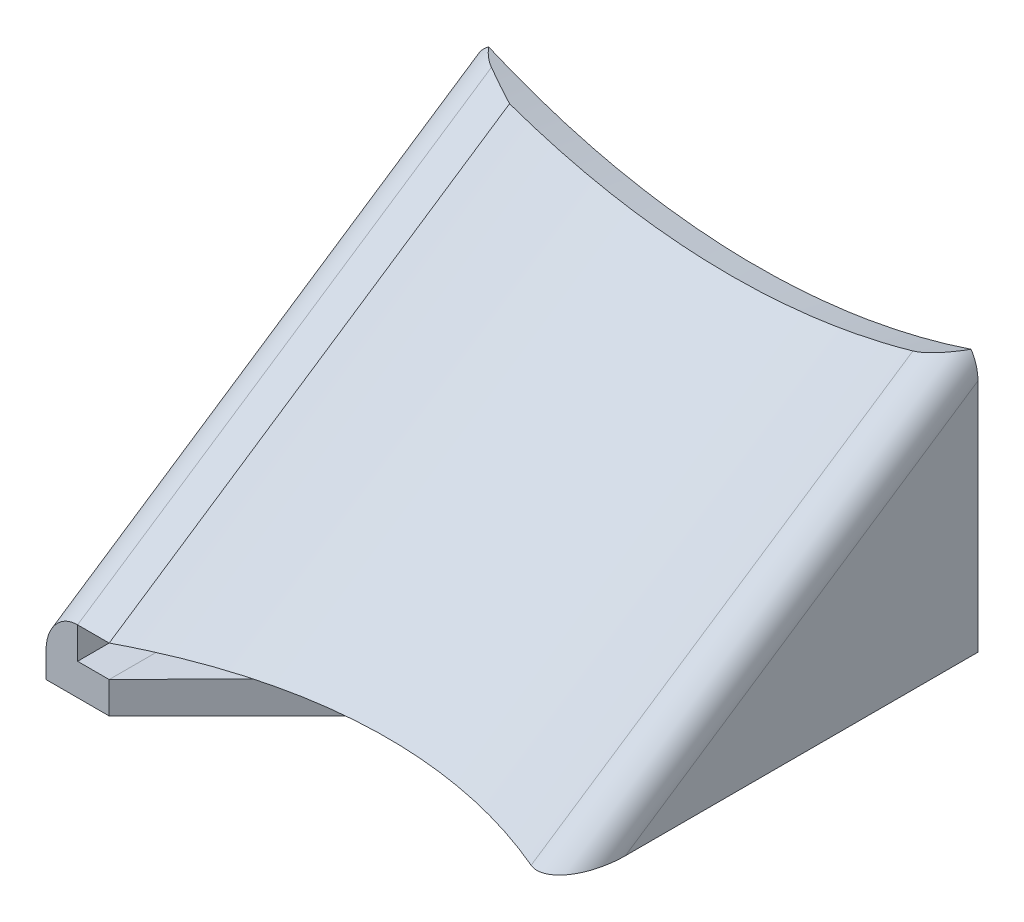
ISO-10303-21;
HEADER;
FILE_DESCRIPTION(('STEP AP214'),'2;1');
FILE_NAME('part.step','',(''),(''),'','','');
FILE_SCHEMA(('AUTOMOTIVE_DESIGN { 1 0 10303 214 1 1 1 1 }'));
ENDSEC;
DATA;
#1=APPLICATION_CONTEXT('core data for automotive mechanical design processes');
#2=APPLICATION_PROTOCOL_DEFINITION('international standard','automotive_design',2000,#1);
#3=PRODUCT_CONTEXT('',#1,'mechanical');
#4=PRODUCT('Part','Part','',(#3));
#5=PRODUCT_RELATED_PRODUCT_CATEGORY('part','',(#4));
#6=PRODUCT_DEFINITION_FORMATION('','',#4);
#7=PRODUCT_DEFINITION_CONTEXT('part definition',#1,'design');
#8=PRODUCT_DEFINITION('design','',#6,#7);
#9=PRODUCT_DEFINITION_SHAPE('','',#8);
#10=(LENGTH_UNIT() NAMED_UNIT(*) SI_UNIT(.MILLI.,.METRE.));
#11=(NAMED_UNIT(*) PLANE_ANGLE_UNIT() SI_UNIT($,.RADIAN.));
#12=(NAMED_UNIT(*) SI_UNIT($,.STERADIAN.) SOLID_ANGLE_UNIT());
#13=UNCERTAINTY_MEASURE_WITH_UNIT(LENGTH_MEASURE(1.E-05),#10,'distance_accuracy_value','');
#14=(GEOMETRIC_REPRESENTATION_CONTEXT(3) GLOBAL_UNCERTAINTY_ASSIGNED_CONTEXT((#13)) GLOBAL_UNIT_ASSIGNED_CONTEXT((#10,
#11,#12)) REPRESENTATION_CONTEXT('',''));
#15=CARTESIAN_POINT('',(0.,0.,0.));
#16=DIRECTION('',(0.,0.,1.));
#17=DIRECTION('',(1.,0.,0.));
#18=AXIS2_PLACEMENT_3D('',#15,#16,#17);
#19=CARTESIAN_POINT('',(70.,90.,0.));
#20=DIRECTION('',(0.,0.,1.));
#21=DIRECTION('',(0.,-1.,0.));
#22=AXIS2_PLACEMENT_3D('',#19,#20,#21);
#23=PLANE('',#22);
#24=DIRECTION('',(-1.,0.,0.));
#25=VECTOR('',#24,1.);
#26=CARTESIAN_POINT('',(70.,0.,0.));
#27=LINE('',#26,#25);
#28=CARTESIAN_POINT('',(70.,0.,0.));
#29=VERTEX_POINT('',#28);
#30=CARTESIAN_POINT('',(-90.,0.,0.));
#31=VERTEX_POINT('',#30);
#32=EDGE_CURVE('E211',#29,#31,#27,.T.);
#33=ORIENTED_EDGE('',*,*,#32,.T.);
#34=DIRECTION('',(0.,-1.,0.));
#35=VECTOR('',#34,1.);
#36=CARTESIAN_POINT('',(-90.,0.,0.));
#37=LINE('',#36,#35);
#38=CARTESIAN_POINT('',(-90.,77.9814957484534,0.));
#39=VERTEX_POINT('',#38);
#40=EDGE_CURVE('E186',#39,#31,#37,.T.);
#41=ORIENTED_EDGE('',*,*,#40,.F.);
#42=CARTESIAN_POINT('',(-80.,77.9814957484534,0.));
#43=DIRECTION('',(0.,0.,1.));
#44=DIRECTION('',(0.,-1.,0.));
#45=AXIS2_PLACEMENT_3D('',#42,#43,#44);
#46=ELLIPSE('',#45,12.0185042515466,10.);
#47=CARTESIAN_POINT('',(-84.8864331464548,88.4674441470801,0.));
#48=VERTEX_POINT('',#47);
#49=EDGE_CURVE('E276',#39,#48,#46,.F.);
#50=ORIENTED_EDGE('',*,*,#49,.T.);
#51=CARTESIAN_POINT('',(75.2322469372973,84.5789928281893,0.));
#52=CARTESIAN_POINT('',(68.4426071490121,82.0264347304755,0.));
#53=CARTESIAN_POINT('',(61.5629667095326,79.8197184992523,0.));
#54=CARTESIAN_POINT('',(47.6730287027835,76.1135100416009,0.));
#55=CARTESIAN_POINT('',(40.6627395847543,74.6140674031883,0.));
#56=CARTESIAN_POINT('',(26.5617320249976,72.3332450030177,0.));
#57=CARTESIAN_POINT('',(19.4710338555079,71.5518685202711,0.));
#58=CARTESIAN_POINT('',(5.26003556938427,70.7127815661641,0.));
#59=CARTESIAN_POINT('',(-1.86024411687244,70.6550723011129,0.));
#60=CARTESIAN_POINT('',(-16.0793658673201,71.2637355352371,0.));
#61=CARTESIAN_POINT('',(-23.178187489454,71.9301071593707,0.));
#62=CARTESIAN_POINT('',(-37.3035072115741,73.9821575626107,0.));
#63=CARTESIAN_POINT('',(-44.3299850043679,75.3678333915982,0.));
#64=CARTESIAN_POINT('',(-58.2602495971049,78.8485614585445,0.));
#65=CARTESIAN_POINT('',(-65.1640163702962,80.9436086924586,0.));
#66=CARTESIAN_POINT('',(-78.7993709265554,85.8280638720674,0.));
#67=CARTESIAN_POINT('',(-85.5309532171606,88.6174216329643,0.));
#68=CARTESIAN_POINT('',(-92.1522909001158,91.7440495687223,0.));
#69=B_SPLINE_CURVE_WITH_KNOTS('',3,(#51,#52,#53,#54,#55,#56,#57,#58,#59,#60,#61,#62,#63,#64,#65,
#66,#67,#68),.UNSPECIFIED.,.F.,.F.,(4,2,2,2,2,2,2,2,4),(2.76722888940884,2.85191941369012,
2.93660993797139,3.02130046225267,3.10599098653394,3.19068151081522,3.27537203509649,
3.36006255937777,3.44475308365904),.UNSPECIFIED.);
#70=CARTESIAN_POINT('',(67.7908455985953,81.9319489141123,0.));
#71=VERTEX_POINT('',#70);
#72=EDGE_CURVE('E291',#48,#71,#69,.F.);
#73=ORIENTED_EDGE('',*,*,#72,.T.);
#74=CARTESIAN_POINT('',(60.,74.3973220106822,0.));
#75=DIRECTION('',(0.,0.,1.));
#76=DIRECTION('',(0.,1.,0.));
#77=AXIS2_PLACEMENT_3D('',#74,#75,#76);
#78=ELLIPSE('',#77,12.0185042515466,10.);
#79=CARTESIAN_POINT('',(70.,74.3973220106822,0.));
#80=VERTEX_POINT('',#79);
#81=EDGE_CURVE('E287',#71,#80,#78,.F.);
#82=ORIENTED_EDGE('',*,*,#81,.T.);
#83=DIRECTION('',(0.,1.,0.));
#84=VECTOR('',#83,1.);
#85=CARTESIAN_POINT('',(70.,90.,0.));
#86=LINE('',#85,#84);
#87=EDGE_CURVE('E206',#29,#80,#86,.T.);
#88=ORIENTED_EDGE('',*,*,#87,.F.);
#89=EDGE_LOOP('',(#33,#41,#50,#73,#82,#88));
#90=FACE_BOUND('',#89,.T.);
#91=ADVANCED_FACE('F41',(#90),#23,.F.);
#92=CARTESIAN_POINT('',(-90.,-10.,0.));
#93=VERTEX_POINT('',#92);
#94=CARTESIAN_POINT('',(-90.,-20.,0.));
#95=VERTEX_POINT('',#94);
#96=EDGE_CURVE('E185',#93,#95,#37,.T.);
#97=ORIENTED_EDGE('',*,*,#96,.F.);
#98=DIRECTION('',(1.,0.,0.));
#99=VECTOR('',#98,1.);
#100=CARTESIAN_POINT('',(-225.369863706809,-10.,0.));
#101=LINE('',#100,#99);
#102=CARTESIAN_POINT('',(-70.,-10.,0.));
#103=VERTEX_POINT('',#102);
#104=EDGE_CURVE('E157',#93,#103,#101,.T.);
#105=ORIENTED_EDGE('',*,*,#104,.T.);
#106=DIRECTION('',(0.999965279586122,0.00833304399655103,0.));
#107=VECTOR('',#106,1.);
#108=CARTESIAN_POINT('',(-70.,-10.,0.));
#109=LINE('',#108,#107);
#110=CARTESIAN_POINT('',(-10.,-9.50000000000001,0.));
#111=VERTEX_POINT('',#110);
#112=EDGE_CURVE('E172',#103,#111,#109,.T.);
#113=ORIENTED_EDGE('',*,*,#112,.T.);
#114=DIRECTION('',(0.,1.,0.));
#115=VECTOR('',#114,1.);
#116=CARTESIAN_POINT('',(-10.,-20.,0.));
#117=LINE('',#116,#115);
#118=CARTESIAN_POINT('',(-10.,-20.,0.));
#119=VERTEX_POINT('',#118);
#120=EDGE_CURVE('E182',#119,#111,#117,.T.);
#121=ORIENTED_EDGE('',*,*,#120,.F.);
#122=DIRECTION('',(1.,0.,0.));
#123=VECTOR('',#122,1.);
#124=CARTESIAN_POINT('',(-90.,-20.,0.));
#125=LINE('',#124,#123);
#126=EDGE_CURVE('E199',#95,#119,#125,.T.);
#127=ORIENTED_EDGE('',*,*,#126,.F.);
#128=EDGE_LOOP('',(#97,#105,#113,#121,#127));
#129=FACE_BOUND('',#128,.T.);
#130=ADVANCED_FACE('F254',(#129),#23,.F.);
#131=CARTESIAN_POINT('',(70.,0.,0.));
#132=DIRECTION('',(0.,1.,0.));
#133=DIRECTION('',(0.,0.,1.));
#134=AXIS2_PLACEMENT_3D('',#131,#132,#133);
#135=PLANE('',#134);
#136=DIRECTION('',(0.,0.,-1.));
#137=VECTOR('',#136,1.);
#138=CARTESIAN_POINT('',(70.,0.,0.));
#139=LINE('',#138,#137);
#140=CARTESIAN_POINT('',(70.,0.,111.595983016023));
#141=VERTEX_POINT('',#140);
#142=EDGE_CURVE('E209',#141,#29,#139,.T.);
#143=ORIENTED_EDGE('',*,*,#142,.F.);
#144=CARTESIAN_POINT('',(60.,0.,111.595983016023));
#145=DIRECTION('',(0.,1.,0.));
#146=DIRECTION('',(0.,0.,-1.));
#147=AXIS2_PLACEMENT_3D('',#144,#145,#146);
#148=ELLIPSE('',#147,18.0277563773199,10.);
#149=CARTESIAN_POINT('',(57.6923076923077,0.,129.137143402164));
#150=VERTEX_POINT('',#149);
#151=EDGE_CURVE('E277',#141,#150,#148,.F.);
#152=ORIENTED_EDGE('',*,*,#151,.T.);
#153=CARTESIAN_POINT('',(0.,0.,567.666153055679));
#154=DIRECTION('',(0.,1.,0.));
#155=DIRECTION('',(0.,0.,-1.));
#156=AXIS2_PLACEMENT_3D('',#153,#154,#155);
#157=ELLIPSE('',#156,450.693909432999,250.);
#158=CARTESIAN_POINT('',(-70.,0.,135.));
#159=VERTEX_POINT('',#158);
#160=EDGE_CURVE('E202',#150,#159,#157,.T.);
#161=ORIENTED_EDGE('',*,*,#160,.T.);
#162=DIRECTION('',(1.,0.,0.));
#163=VECTOR('',#162,1.);
#164=CARTESIAN_POINT('',(-90.,0.,135.));
#165=LINE('',#164,#163);
#166=CARTESIAN_POINT('',(-80.,0.,135.));
#167=VERTEX_POINT('',#166);
#168=EDGE_CURVE('E194',#167,#159,#165,.T.);
#169=ORIENTED_EDGE('',*,*,#168,.F.);
#170=DIRECTION('',(0.,0.,1.));
#171=VECTOR('',#170,1.);
#172=CARTESIAN_POINT('',(-80.,0.,0.));
#173=LINE('',#172,#171);
#174=CARTESIAN_POINT('',(-80.,0.,60.));
#175=VERTEX_POINT('',#174);
#176=EDGE_CURVE('E163',#175,#167,#173,.T.);
#177=ORIENTED_EDGE('',*,*,#176,.F.);
#178=CARTESIAN_POINT('',(-140.,0.,60.));
#179=DIRECTION('',(0.,1.,0.));
#180=DIRECTION('',(0.,0.,1.));
#181=AXIS2_PLACEMENT_3D('',#178,#179,#180);
#182=CIRCLE('',#181,60.);
#183=CARTESIAN_POINT('',(-90.,0.,26.833752096446));
#184=VERTEX_POINT('',#183);
#185=EDGE_CURVE('E318',#175,#184,#182,.T.);
#186=ORIENTED_EDGE('',*,*,#185,.T.);
#187=DIRECTION('',(0.,0.,1.));
#188=VECTOR('',#187,1.);
#189=CARTESIAN_POINT('',(-90.,0.,0.));
#190=LINE('',#189,#188);
#191=EDGE_CURVE('E320',#31,#184,#190,.T.);
#192=ORIENTED_EDGE('',*,*,#191,.F.);
#193=ORIENTED_EDGE('',*,*,#32,.F.);
#194=EDGE_LOOP('',(#143,#152,#161,#169,#177,#186,#192,#193));
#195=FACE_BOUND('',#194,.T.);
#196=ADVANCED_FACE('F250',(#195),#135,.F.);
#197=CARTESIAN_POINT('',(70.,0.,0.));
#198=DIRECTION('',(-1.,0.,0.));
#199=DIRECTION('',(0.,0.,1.));
#200=AXIS2_PLACEMENT_3D('',#197,#198,#199);
#201=PLANE('',#200);
#202=ORIENTED_EDGE('',*,*,#87,.T.);
#203=DIRECTION('',(0.,0.554700196225229,-0.832050294337844));
#204=VECTOR('',#203,1.);
#205=CARTESIAN_POINT('',(70.,51.5058383150877,34.3372255433918));
#206=LINE('',#205,#204);
#207=EDGE_CURVE('E390',#80,#141,#206,.F.);
#208=ORIENTED_EDGE('',*,*,#207,.T.);
#209=ORIENTED_EDGE('',*,*,#142,.T.);
#210=EDGE_LOOP('',(#202,#208,#209));
#211=FACE_BOUND('',#210,.T.);
#212=ADVANCED_FACE('F246',(#211),#201,.F.);
#213=CARTESIAN_POINT('',(0.,199.692070641082,268.128047094055));
#214=DIRECTION('',(0.,0.554700196225229,-0.832050294337844));
#215=DIRECTION('',(0.,0.832050294337844,0.554700196225229));
#216=AXIS2_PLACEMENT_3D('',#213,#214,#215);
#217=CYLINDRICAL_SURFACE('',#216,250.);
#218=DIRECTION('',(0.,0.554700196225229,-0.832050294337844));
#219=VECTOR('',#218,1.);
#220=CARTESIAN_POINT('',(57.6923076923077,-2.70593381438583,133.196044123743));
#221=LINE('',#220,#219);
#222=CARTESIAN_POINT('',(57.6923076923077,80.5633769427983,8.29207798796668));
#223=VERTEX_POINT('',#222);
#224=EDGE_CURVE('E269',#150,#223,#221,.T.);
#225=ORIENTED_EDGE('',*,*,#224,.T.);
#226=CARTESIAN_POINT('',(-91.4201081785502,93.2946358244354,8.24513855791665));
#227=CARTESIAN_POINT('',(-84.8513793781062,90.1852063146247,8.25660417521486));
#228=CARTESIAN_POINT('',(-78.1732819026249,87.411191780961,8.26683299337017));
#229=CARTESIAN_POINT('',(-64.6462650871955,82.553604185991,8.28474471646297));
#230=CARTESIAN_POINT('',(-57.7973511960734,80.4700810334355,8.29242743736838));
#231=CARTESIAN_POINT('',(-43.9777675092792,77.0084991665267,8.30519157072707));
#232=CARTESIAN_POINT('',(-37.0071175812429,75.6304454286937,8.31027296482992));
#233=CARTESIAN_POINT('',(-22.9940285474321,73.5896825971203,8.31779801260772));
#234=CARTESIAN_POINT('',(-15.9516095875063,72.9269764372719,8.32024165546438));
#235=CARTESIAN_POINT('',(-1.84546381583988,72.3216612348847,8.32247367662239));
#236=CARTESIAN_POINT('',(5.21824271625837,72.3790530625746,8.32226205171496));
#237=CARTESIAN_POINT('',(19.3163295674137,73.2135245091317,8.31918504668166));
#238=CARTESIAN_POINT('',(26.3506896184155,73.9906029283249,8.31631967097941));
#239=CARTESIAN_POINT('',(40.3396596586385,76.2588793665347,8.30795569633871));
#240=CARTESIAN_POINT('',(47.294249536688,77.7500741245759,8.30245710942472));
#241=CARTESIAN_POINT('',(61.0738270465605,81.4358960978062,8.28886611981032));
#242=CARTESIAN_POINT('',(67.8988062962722,83.6304739977441,8.28077389895367));
#243=CARTESIAN_POINT('',(74.6344999819692,86.1689914157475,8.27141344581334));
#244=B_SPLINE_CURVE_WITH_KNOTS('',3,(#226,#227,#228,#229,#230,#231,#232,#233,#234,#235,#236,
#237,#238,#239,#240,#241,#242,#243),.UNSPECIFIED.,.F.,.F.,(4,2,2,2,2,2,2,2,4),(2.76722888940884,
2.85191941369012,2.93660993797139,3.02130046225267,3.10599098653394,3.19068151081522,
3.27537203509649,3.36006255937777,3.44475308365904),.UNSPECIFIED.);
#245=CARTESIAN_POINT('',(-70.,84.4815779625057,8.27763305624146));
#246=VERTEX_POINT('',#245);
#247=EDGE_CURVE('E226',#223,#246,#244,.F.);
#248=ORIENTED_EDGE('',*,*,#247,.T.);
#249=DIRECTION('',(0.,-0.554700196225229,0.832050294337844));
#250=VECTOR('',#249,1.);
#251=CARTESIAN_POINT('',(-70.,0.,135.));
#252=LINE('',#251,#250);
#253=EDGE_CURVE('E205',#246,#159,#252,.T.);
#254=ORIENTED_EDGE('',*,*,#253,.T.);
#255=ORIENTED_EDGE('',*,*,#160,.F.);
#256=EDGE_LOOP('',(#225,#248,#254,#255));
#257=FACE_BOUND('',#256,.T.);
#258=ADVANCED_FACE('F235',(#257),#217,.F.);
#259=CARTESIAN_POINT('',(-90.,-20.,0.));
#260=DIRECTION('',(0.,1.,0.));
#261=DIRECTION('',(0.,0.,1.));
#262=AXIS2_PLACEMENT_3D('',#259,#260,#261);
#263=PLANE('',#262);
#264=DIRECTION('',(0.,0.,-1.));
#265=VECTOR('',#264,1.);
#266=CARTESIAN_POINT('',(-10.,-20.,135.));
#267=LINE('',#266,#265);
#268=CARTESIAN_POINT('',(-10.,-20.,75.));
#269=VERTEX_POINT('',#268);
#270=EDGE_CURVE('E179',#269,#119,#267,.T.);
#271=ORIENTED_EDGE('',*,*,#270,.F.);
#272=DIRECTION('',(0.707106781186549,0.,-0.707106781186546));
#273=VECTOR('',#272,1.);
#274=CARTESIAN_POINT('',(-10.,-20.,75.));
#275=LINE('',#274,#273);
#276=CARTESIAN_POINT('',(-70.0000000000003,-20.,135.));
#277=VERTEX_POINT('',#276);
#278=EDGE_CURVE('E57',#269,#277,#275,.F.);
#279=ORIENTED_EDGE('',*,*,#278,.T.);
#280=DIRECTION('',(1.,0.,0.));
#281=VECTOR('',#280,1.);
#282=CARTESIAN_POINT('',(-90.,-20.,135.));
#283=LINE('',#282,#281);
#284=CARTESIAN_POINT('',(-90.,-20.,135.));
#285=VERTEX_POINT('',#284);
#286=EDGE_CURVE('E197',#285,#277,#283,.T.);
#287=ORIENTED_EDGE('',*,*,#286,.F.);
#288=DIRECTION('',(0.,0.,1.));
#289=VECTOR('',#288,1.);
#290=CARTESIAN_POINT('',(-90.,-20.,0.));
#291=LINE('',#290,#289);
#292=EDGE_CURVE('E189',#95,#285,#291,.T.);
#293=ORIENTED_EDGE('',*,*,#292,.F.);
#294=ORIENTED_EDGE('',*,*,#126,.T.);
#295=EDGE_LOOP('',(#271,#279,#287,#293,#294));
#296=FACE_BOUND('',#295,.T.);
#297=ADVANCED_FACE('F245',(#296),#263,.F.);
#298=CARTESIAN_POINT('',(-90.,-20.,135.));
#299=DIRECTION('',(0.,0.,-1.));
#300=DIRECTION('',(0.,1.,0.));
#301=AXIS2_PLACEMENT_3D('',#298,#299,#300);
#302=PLANE('',#301);
#303=ORIENTED_EDGE('',*,*,#286,.T.);
#304=DIRECTION('',(0.,1.,0.));
#305=VECTOR('',#304,1.);
#306=CARTESIAN_POINT('',(-70.0000000000003,-20.,135.));
#307=LINE('',#306,#305);
#308=CARTESIAN_POINT('',(-70.,-10.,135.));
#309=VERTEX_POINT('',#308);
#310=EDGE_CURVE('E50',#277,#309,#307,.T.);
#311=ORIENTED_EDGE('',*,*,#310,.T.);
#312=DIRECTION('',(1.,0.,0.));
#313=VECTOR('',#312,1.);
#314=CARTESIAN_POINT('',(-225.369863706809,-10.,135.));
#315=LINE('',#314,#313);
#316=CARTESIAN_POINT('',(-80.,-10.,135.));
#317=VERTEX_POINT('',#316);
#318=EDGE_CURVE('E150',#317,#309,#315,.T.);
#319=ORIENTED_EDGE('',*,*,#318,.F.);
#320=DIRECTION('',(0.,-1.,0.));
#321=VECTOR('',#320,1.);
#322=CARTESIAN_POINT('',(-80.,0.,135.));
#323=LINE('',#322,#321);
#324=EDGE_CURVE('E160',#167,#317,#323,.T.);
#325=ORIENTED_EDGE('',*,*,#324,.F.);
#326=CARTESIAN_POINT('',(-80.,-12.0185042515466,135.));
#327=DIRECTION('',(0.,0.,-1.));
#328=DIRECTION('',(0.,-1.,0.));
#329=AXIS2_PLACEMENT_3D('',#326,#327,#328);
#330=ELLIPSE('',#329,12.0185042515466,10.);
#331=CARTESIAN_POINT('',(-90.,-12.0185042515466,135.));
#332=VERTEX_POINT('',#331);
#333=EDGE_CURVE('E290',#167,#332,#330,.F.);
#334=ORIENTED_EDGE('',*,*,#333,.T.);
#335=DIRECTION('',(0.,1.,0.));
#336=VECTOR('',#335,1.);
#337=CARTESIAN_POINT('',(-90.,-20.,135.));
#338=LINE('',#337,#336);
#339=EDGE_CURVE('E191',#285,#332,#338,.T.);
#340=ORIENTED_EDGE('',*,*,#339,.F.);
#341=EDGE_LOOP('',(#303,#311,#319,#325,#334,#340));
#342=FACE_BOUND('',#341,.T.);
#343=ADVANCED_FACE('F168',(#342),#302,.F.);
#344=CARTESIAN_POINT('',(-90.,0.,135.));
#345=DIRECTION('',(0.,-0.832050294337844,-0.554700196225229));
#346=DIRECTION('',(0.,0.554700196225229,-0.832050294337844));
#347=AXIS2_PLACEMENT_3D('',#344,#345,#346);
#348=PLANE('',#347);
#349=ORIENTED_EDGE('',*,*,#253,.F.);
#350=CARTESIAN_POINT('',(-80.,87.3255929935656,4.01161050965155));
#351=CARTESIAN_POINT('',(-79.584785223112,87.1995722226688,4.20064169642261));
#352=CARTESIAN_POINT('',(-79.1688194607939,87.0743126874509,4.3885314024997));
#353=CARTESIAN_POINT('',(-78.3366822527016,86.8257239847639,4.76141555162988));
#354=CARTESIAN_POINT('',(-77.9205154514133,86.7023900329927,4.94641717023663));
#355=CARTESIAN_POINT('',(-77.0879764805763,86.4576545912011,5.31352155033164));
#356=CARTESIAN_POINT('',(-76.6716088725192,86.336248327241,5.49563147322845));
#357=CARTESIAN_POINT('',(-75.8386687207363,86.0953705138052,5.85694885472443));
#358=CARTESIAN_POINT('',(-75.4221006532771,85.9758942024434,6.03616345734216));
#359=CARTESIAN_POINT('',(-74.5887599383286,85.7388786135672,6.3916866612861));
#360=CARTESIAN_POINT('',(-74.1719916802927,85.6213345882641,6.5680023856501));
#361=CARTESIAN_POINT('',(-73.3382509338673,85.3881859782985,6.91772434475831));
#362=CARTESIAN_POINT('',(-72.9212827463642,85.2725766619945,7.09113767794568));
#363=CARTESIAN_POINT('',(-72.0871424002862,85.0432999753012,7.43505141990884));
#364=CARTESIAN_POINT('',(-71.66997445259,84.9296278915005,7.60555889882332));
#365=CARTESIAN_POINT('',(-70.8354350876824,84.7042282498682,7.94365753136258));
#366=CARTESIAN_POINT('',(-70.4180677893724,84.5924959988891,8.11125572336569));
#367=CARTESIAN_POINT('',(-69.9999983440692,84.4815779625057,8.27763305624149));
#368=B_SPLINE_CURVE_WITH_KNOTS('',3,(#350,#351,#352,#353,#354,#355,#356,#357,#358,#359,#360,
#361,#362,#363,#364,#365,#366,#367),.UNSPECIFIED.,.F.,.F.,(4,2,2,2,2,2,2,2,4),(0.,
1.41991185135524,2.83541716686989,4.24657243226211,5.65343502278761,7.0560632063037,
8.4545161459993,9.84885389821146,11.2391372098221),.UNSPECIFIED.);
#369=CARTESIAN_POINT('',(-80.,87.3255929935657,4.01161050965143));
#370=VERTEX_POINT('',#369);
#371=EDGE_CURVE('E302',#246,#370,#368,.F.);
#372=ORIENTED_EDGE('',*,*,#371,.T.);
#373=DIRECTION('',(0.,0.554700196225229,-0.832050294337844));
#374=VECTOR('',#373,1.);
#375=CARTESIAN_POINT('',(-80.,0.,135.));
#376=LINE('',#375,#374);
#377=EDGE_CURVE('E232',#370,#167,#376,.F.);
#378=ORIENTED_EDGE('',*,*,#377,.T.);
#379=ORIENTED_EDGE('',*,*,#168,.T.);
#380=EDGE_LOOP('',(#349,#372,#378,#379));
#381=FACE_BOUND('',#380,.T.);
#382=ADVANCED_FACE('F300',(#381),#348,.F.);
#383=CARTESIAN_POINT('',(-90.,0.,0.));
#384=DIRECTION('',(-1.,0.,0.));
#385=DIRECTION('',(0.,0.,1.));
#386=AXIS2_PLACEMENT_3D('',#383,#384,#385);
#387=PLANE('',#386);
#388=ORIENTED_EDGE('',*,*,#40,.T.);
#389=ORIENTED_EDGE('',*,*,#191,.T.);
#390=DIRECTION('',(0.,1.,0.));
#391=VECTOR('',#390,1.);
#392=CARTESIAN_POINT('',(-90.,-5.00000000000001,26.833752096446));
#393=LINE('',#392,#391);
#394=CARTESIAN_POINT('',(-90.,-10.,26.833752096446));
#395=VERTEX_POINT('',#394);
#396=EDGE_CURVE('E325',#184,#395,#393,.F.);
#397=ORIENTED_EDGE('',*,*,#396,.T.);
#398=DIRECTION('',(0.,0.,-1.));
#399=VECTOR('',#398,1.);
#400=CARTESIAN_POINT('',(-90.,-10.,135.));
#401=LINE('',#400,#399);
#402=EDGE_CURVE('E323',#395,#93,#401,.T.);
#403=ORIENTED_EDGE('',*,*,#402,.T.);
#404=ORIENTED_EDGE('',*,*,#96,.T.);
#405=ORIENTED_EDGE('',*,*,#292,.T.);
#406=ORIENTED_EDGE('',*,*,#339,.T.);
#407=DIRECTION('',(0.,0.554700196225229,-0.832050294337844));
#408=VECTOR('',#407,1.);
#409=CARTESIAN_POINT('',(-90.,81.6794970566216,-5.54700196225231));
#410=LINE('',#409,#408);
#411=EDGE_CURVE('E289',#332,#39,#410,.T.);
#412=ORIENTED_EDGE('',*,*,#411,.T.);
#413=EDGE_LOOP('',(#388,#389,#397,#403,#404,#405,#406,#412));
#414=FACE_BOUND('',#413,.T.);
#415=ADVANCED_FACE('F307',(#414),#387,.T.);
#416=CARTESIAN_POINT('',(-10.,0.,0.));
#417=DIRECTION('',(-1.,0.,0.));
#418=DIRECTION('',(0.,0.,1.));
#419=AXIS2_PLACEMENT_3D('',#416,#417,#418);
#420=PLANE('',#419);
#421=DIRECTION('',(0.,0.,1.));
#422=VECTOR('',#421,1.);
#423=CARTESIAN_POINT('',(-10.,-9.50000000000001,0.));
#424=LINE('',#423,#422);
#425=CARTESIAN_POINT('',(-10.,-9.50000000000001,75.));
#426=VERTEX_POINT('',#425);
#427=EDGE_CURVE('E176',#111,#426,#424,.T.);
#428=ORIENTED_EDGE('',*,*,#427,.T.);
#429=DIRECTION('',(0.,-1.,0.));
#430=VECTOR('',#429,1.);
#431=CARTESIAN_POINT('',(-10.,-1.04083408558609E-13,75.));
#432=LINE('',#431,#430);
#433=EDGE_CURVE('E313',#426,#269,#432,.T.);
#434=ORIENTED_EDGE('',*,*,#433,.T.);
#435=ORIENTED_EDGE('',*,*,#270,.T.);
#436=ORIENTED_EDGE('',*,*,#120,.T.);
#437=EDGE_LOOP('',(#428,#434,#435,#436));
#438=FACE_BOUND('',#437,.T.);
#439=ADVANCED_FACE('F403',(#438),#420,.F.);
#440=CARTESIAN_POINT('',(-70.,-10.,0.));
#441=DIRECTION('',(0.00833304399655103,-0.999965279586122,0.));
#442=DIRECTION('',(0.999965279586122,0.00833304399655103,0.));
#443=AXIS2_PLACEMENT_3D('',#440,#441,#442);
#444=PLANE('',#443);
#445=DIRECTION('',(0.,0.,1.));
#446=VECTOR('',#445,1.);
#447=CARTESIAN_POINT('',(-70.,-10.,0.));
#448=LINE('',#447,#446);
#449=EDGE_CURVE('E175',#103,#309,#448,.T.);
#450=ORIENTED_EDGE('',*,*,#449,.T.);
#451=DIRECTION('',(-0.707094505346836,-0.00589245421122364,0.707094505346833));
#452=VECTOR('',#451,1.);
#453=CARTESIAN_POINT('',(-9.96041804104026,-9.49967015034201,74.9604180410403));
#454=LINE('',#453,#452);
#455=EDGE_CURVE('E13',#309,#426,#454,.F.);
#456=ORIENTED_EDGE('',*,*,#455,.T.);
#457=ORIENTED_EDGE('',*,*,#427,.F.);
#458=ORIENTED_EDGE('',*,*,#112,.F.);
#459=EDGE_LOOP('',(#450,#456,#457,#458));
#460=FACE_BOUND('',#459,.T.);
#461=ADVANCED_FACE('F401',(#460),#444,.F.);
#462=CARTESIAN_POINT('',(60.,-10.8018539926046,127.79876400493));
#463=DIRECTION('',(0.,0.554700196225229,-0.832050294337844));
#464=DIRECTION('',(0.,0.832050294337844,0.554700196225229));
#465=AXIS2_PLACEMENT_3D('',#462,#463,#464);
#466=CYLINDRICAL_SURFACE('',#465,10.);
#467=ORIENTED_EDGE('',*,*,#81,.F.);
#468=CARTESIAN_POINT('',(57.6923057168745,80.5633801838008,8.29207228183473));
#469=CARTESIAN_POINT('',(57.8157902294219,80.5986685014293,8.29195675930392));
#470=CARTESIAN_POINT('',(57.9394454527208,80.6333741188761,8.28828286202455));
#471=CARTESIAN_POINT('',(58.1876398723767,80.7018039037068,8.27396860514754));
#472=CARTESIAN_POINT('',(58.3121786524504,80.7355186193769,8.2632755671629));
#473=CARTESIAN_POINT('',(58.4677583851585,80.7768788202686,8.24563189448065));
#474=CARTESIAN_POINT('',(58.4990150592401,80.7851498834792,8.24187011337456));
#475=CARTESIAN_POINT('',(58.6219544866948,80.8175322049862,8.22622782973943));
#476=CARTESIAN_POINT('',(58.7135204861712,80.8413230627606,8.21272353439767));
#477=CARTESIAN_POINT('',(58.9277683573087,80.896234331953,8.17685445125251));
#478=CARTESIAN_POINT('',(59.0502875241459,80.9270520052364,8.15304012858375));
#479=CARTESIAN_POINT('',(59.2338275573101,80.9723663496378,8.11254504852753));
#480=CARTESIAN_POINT('',(59.295240816376,80.9873839331167,8.09817625480676));
#481=CARTESIAN_POINT('',(59.4160017420496,81.0166346973739,8.06834126001015));
#482=CARTESIAN_POINT('',(59.4753577667764,81.0308780020348,8.05291883276182));
#483=CARTESIAN_POINT('',(59.6538628867604,81.0733141581672,8.00428364727864));
#484=CARTESIAN_POINT('',(59.7725506684127,81.1009916904333,7.96890254480203));
#485=CARTESIAN_POINT('',(60.009863981246,81.1552752042034,7.89219757508368));
#486=CARTESIAN_POINT('',(60.1284719948782,81.1818645331875,7.85080805336483));
#487=CARTESIAN_POINT('',(60.3656438828694,81.2339758863332,7.76209635039016));
#488=CARTESIAN_POINT('',(60.4841842852225,81.2594779688847,7.71469978479615));
#489=CARTESIAN_POINT('',(60.7212320236031,81.3094170161581,7.61398367229842));
#490=CARTESIAN_POINT('',(60.8397095829863,81.3338309534058,7.56058277194551));
#491=CARTESIAN_POINT('',(61.0687308854891,81.3799999468675,7.45162665896983));
#492=CARTESIAN_POINT('',(61.1793751487695,81.4018269109971,7.39631261969378));
#493=CARTESIAN_POINT('',(61.4000627925784,81.4444203118393,7.28074211857791));
#494=CARTESIAN_POINT('',(61.5100816923856,81.4651702337033,7.22043285752112));
#495=CARTESIAN_POINT('',(61.7295266589181,81.5056081336516,7.09487848470678));
#496=CARTESIAN_POINT('',(61.8389237860862,81.5252775925474,7.02957691840594));
#497=CARTESIAN_POINT('',(62.0571373730316,81.5635534662905,6.89403954881289));
#498=CARTESIAN_POINT('',(62.165920610849,81.5821395536955,6.82374450380156));
#499=CARTESIAN_POINT('',(62.3280027317814,81.6091097711034,6.71504931750807));
#500=CARTESIAN_POINT('',(62.3821623148614,81.6179977511212,6.67804873140948));
#501=CARTESIAN_POINT('',(62.4869127030769,81.6349506910553,6.60518785090943));
#502=CARTESIAN_POINT('',(62.5375353165339,81.6430339890063,6.56937755220058));
#503=CARTESIAN_POINT('',(62.6894717550163,81.666966826001,6.46011097822761));
#504=CARTESIAN_POINT('',(62.7899700035737,81.6823524855969,6.38541376009424));
#505=CARTESIAN_POINT('',(62.9899900014381,81.7120958607699,6.23199095540977));
#506=CARTESIAN_POINT('',(63.0894846091431,81.7264386350139,6.15322716776228));
#507=CARTESIAN_POINT('',(63.2875061100745,81.7540929808992,5.99167112875337));
#508=CARTESIAN_POINT('',(63.3860031534281,81.7673885436531,5.9088395671038));
#509=CARTESIAN_POINT('',(63.5820353313347,81.7929448397013,5.73914997223788));
#510=CARTESIAN_POINT('',(63.6795380493894,81.8051886142036,5.65225196780293));
#511=CARTESIAN_POINT('',(63.8673795012533,81.8278870139461,5.48011716331005));
#512=CARTESIAN_POINT('',(63.9578331247533,81.8384003885249,5.39501332711959));
#513=CARTESIAN_POINT('',(64.1375152384513,81.8584556301382,5.221587507706));
#514=CARTESIAN_POINT('',(64.2267218088927,81.8679864891169,5.13324154750555));
#515=CARTESIAN_POINT('',(64.4039136183172,81.8860723124588,4.95333325587902));
#516=CARTESIAN_POINT('',(64.4918751929135,81.8946155996089,4.86174646372617));
#517=CARTESIAN_POINT('',(64.6665821288115,81.9107218744489,4.67535562944822));
#518=CARTESIAN_POINT('',(64.753302205399,81.9182725806719,4.58052681736108));
#519=CARTESIAN_POINT('',(64.8820841469786,81.9288282690277,4.43630662840412));
#520=CARTESIAN_POINT('',(64.9249802456619,81.932231637171,4.38768618881222));
#521=CARTESIAN_POINT('',(65.0087578195589,81.9386589547567,4.29159771124887));
#522=CARTESIAN_POINT('',(65.0496581847553,81.9416918733062,4.24414674295436));
#523=CARTESIAN_POINT('',(65.1720690575626,81.9504536692281,4.10051150798623));
#524=CARTESIAN_POINT('',(65.2527777506882,81.9558037797695,4.00361857292762));
#525=CARTESIAN_POINT('',(65.4127575038838,81.9655561888206,3.80721273491477));
#526=CARTESIAN_POINT('',(65.4920101720616,81.9699499187407,3.70768444657505));
#527=CARTESIAN_POINT('',(65.6490815691869,81.9777848411039,3.50600696278357));
#528=CARTESIAN_POINT('',(65.7268807145228,81.9812170117179,3.40384216694836));
#529=CARTESIAN_POINT('',(65.8810473584602,81.9871241112717,3.19689228216358));
#530=CARTESIAN_POINT('',(65.9573941412035,81.9895896037129,3.09209149902436));
#531=CARTESIAN_POINT('',(66.106387954921,81.993498949426,2.88305433037164));
#532=CARTESIAN_POINT('',(66.1790785782441,81.9949624486592,2.77884936614699));
#533=CARTESIAN_POINT('',(66.3228378997752,81.9969647935093,2.56832894154907));
#534=CARTESIAN_POINT('',(66.3938930799241,81.9974976022379,2.46200419394469));
#535=CARTESIAN_POINT('',(66.5343830283057,81.997633776481,2.2472448508764));
#536=CARTESIAN_POINT('',(66.6038033075411,81.9972307304255,2.13880077816087));
#537=CARTESIAN_POINT('',(66.7410255584431,81.9954904164023,1.91980180326215));
#538=CARTESIAN_POINT('',(66.8088121153884,81.9941463848124,1.80923729088976));
#539=CARTESIAN_POINT('',(66.9090851663624,81.9914314947374,1.64213105335258));
#540=CARTESIAN_POINT('',(66.9423668922846,81.9904061699013,1.58605915862867));
#541=CARTESIAN_POINT('',(67.0076064965777,81.9881510891779,1.4749495105447));
#542=CARTESIAN_POINT('',(67.039577005318,81.9869268036646,1.41991906221473));
#543=CARTESIAN_POINT('',(67.1349329629048,81.982915270134,1.25403269505745));
#544=CARTESIAN_POINT('',(67.1975477774274,81.9797952161288,1.14274043844328));
#545=CARTESIAN_POINT('',(67.3210179329623,81.9726611297661,0.918530758334718));
#546=CARTESIAN_POINT('',(67.3818636160826,81.9686429627155,0.805608153718933));
#547=CARTESIAN_POINT('',(67.5017966383483,81.9597081203053,0.578136883782662));
#548=CARTESIAN_POINT('',(67.5608735248549,81.9547870022586,0.463582882319136));
#549=CARTESIAN_POINT('',(67.6772701091113,81.9440421800852,0.232848795487588));
#550=CARTESIAN_POINT('',(67.734578582743,81.93821374102,0.116663267616089));
#551=CARTESIAN_POINT('',(67.7908459294731,81.9319494585687,0.));
#552=B_SPLINE_CURVE_WITH_KNOTS('',3,(#468,#469,#470,#471,#472,#473,#474,#475,#476,#477,#478,
#479,#480,#481,#482,#483,#484,#485,#486,#487,#488,#489,#490,#491,#492,#493,#494,#495,#496,#497,
#498,#499,#500,#501,#502,#503,#504,#505,#506,#507,#508,#509,#510,#511,#512,#513,#514,#515,#516,
#517,#518,#519,#520,#521,#522,#523,#524,#525,#526,#527,#528,#529,#530,#531,#532,#533,#534,#535,
#536,#537,#538,#539,#540,#541,#542,#543,#544,#545,#546,#547,#548,#549,#550,#551),.UNSPECIFIED.,
.F.,.F.,(4,2,2,2,2,2,2,2,2,2,2,2,2,2,2,2,2,2,2,2,2,2,2,2,2,2,2,2,2,2,2,2,2,2,2,2,2,2,2,2,2,4),
(0.,0.385253698994555,0.773432286600009,0.871083133769186,1.15770320415322,1.54319859572562,
1.73768694837252,1.92654875861399,2.30710910091673,2.69219407479184,3.08262506635601,
3.47918982385983,3.85592869923076,4.23734106383415,4.62399654693659,5.01644160359255,
5.21500714112187,5.40259855197546,5.78100675974927,6.16406129479709,6.55214439646663,
6.94562346327625,7.31949707471243,7.69718573133548,8.07896169258632,8.46508852462401,
8.6598672968978,8.84801942350444,9.22663241710869,9.60850938714841,9.99385769940029,
10.3828792373104,10.7640362660669,11.1476566000382,11.5339128759356,11.9229743771103,
12.1186115745257,12.3095739722738,12.6927533290368,13.0777344781959,13.4646632346245,
13.8536834442049),.UNSPECIFIED.);
#553=EDGE_CURVE('E382',#71,#223,#552,.F.);
#554=ORIENTED_EDGE('',*,*,#553,.T.);
#555=ORIENTED_EDGE('',*,*,#224,.F.);
#556=ORIENTED_EDGE('',*,*,#151,.F.);
#557=ORIENTED_EDGE('',*,*,#207,.F.);
#558=EDGE_LOOP('',(#467,#554,#555,#556,#557));
#559=FACE_BOUND('',#558,.T.);
#560=ADVANCED_FACE('F259',(#559),#466,.T.);
#561=CARTESIAN_POINT('',(-80.,53.9871893643139,35.9914595762092));
#562=DIRECTION('',(0.,-0.554700196225229,0.832050294337844));
#563=DIRECTION('',(0.,-0.832050294337844,-0.554700196225229));
#564=AXIS2_PLACEMENT_3D('',#561,#562,#563);
#565=CYLINDRICAL_SURFACE('',#564,10.);
#566=ORIENTED_EDGE('',*,*,#377,.F.);
#567=CARTESIAN_POINT('',(-84.8864341100153,88.4674468992516,0.));
#568=CARTESIAN_POINT('',(-84.8001684003352,88.4543747798862,0.106708292697172));
#569=CARTESIAN_POINT('',(-84.7128094718864,88.4406639696683,0.212457910370034));
#570=CARTESIAN_POINT('',(-84.5368100188848,88.4120879728168,0.420818864301139));
#571=CARTESIAN_POINT('',(-84.4481924429818,88.397236354163,0.523451452299787));
#572=CARTESIAN_POINT('',(-84.2696733207836,88.3663842435331,0.725579189411032));
#573=CARTESIAN_POINT('',(-84.1797934408035,88.3503967088211,0.825095437161353));
#574=CARTESIAN_POINT('',(-83.9987489675358,88.3172789072437,1.02098992394141));
#575=CARTESIAN_POINT('',(-83.9076046563352,88.3001609226017,1.11738897837857));
#576=CARTESIAN_POINT('',(-83.7203027409776,88.264070368161,1.31090098429813));
#577=CARTESIAN_POINT('',(-83.6240776332046,88.2450563886772,1.40794094002903));
#578=CARTESIAN_POINT('',(-83.4305889438211,88.2058635111801,1.59821363467944));
#579=CARTESIAN_POINT('',(-83.3333538588518,88.1857023739264,1.69147899141316));
#580=CARTESIAN_POINT('',(-83.1378434278775,88.1442207635853,1.87420227510521));
#581=CARTESIAN_POINT('',(-83.0395947419422,88.1229171909309,1.96369254206235));
#582=CARTESIAN_POINT('',(-82.8420557434163,88.0791564938544,2.13886512347101));
#583=CARTESIAN_POINT('',(-82.7427901143873,88.0567153088203,2.22457924028201));
#584=CARTESIAN_POINT('',(-82.539055008305,88.0097260298545,2.39569564795639));
#585=CARTESIAN_POINT('',(-82.4345193735158,87.9851343690381,2.48100730996004));
#586=CARTESIAN_POINT('',(-82.2247333628088,87.9347982086924,2.6470994735934));
#587=CARTESIAN_POINT('',(-82.1195156979659,87.9090757791092,2.72792794136031));
#588=CARTESIAN_POINT('',(-81.9083635989111,87.856482936386,2.88505363064809));
#589=CARTESIAN_POINT('',(-81.8024591191358,87.8296332770138,2.96139800650295));
#590=CARTESIAN_POINT('',(-81.5899322831107,87.7747911711763,3.10955502921357));
#591=CARTESIAN_POINT('',(-81.4833369306138,87.7468179982986,3.1814135195188));
#592=CARTESIAN_POINT('',(-81.2625929884319,87.6879110563343,3.32504849240695));
#593=CARTESIAN_POINT('',(-81.1483381934486,87.6568990068073,3.39663001449605));
#594=CARTESIAN_POINT('',(-80.9195293227281,87.593717798758,3.53426782337508));
#595=CARTESIAN_POINT('',(-80.8050105741207,87.5615757905244,3.60039522628529));
#596=CARTESIAN_POINT('',(-80.5756704540884,87.4961378471934,3.72712522891276));
#597=CARTESIAN_POINT('',(-80.4608799139052,87.4628667498959,3.78779631607083));
#598=CARTESIAN_POINT('',(-80.2310016007476,87.3951778535006,3.90361667684201));
#599=CARTESIAN_POINT('',(-80.1159398810574,87.360782269094,3.9588306979132));
#600=CARTESIAN_POINT('',(-80.,87.3255929935656,4.01161050965155));
#601=B_SPLINE_CURVE_WITH_KNOTS('',3,(#567,#568,#569,#570,#571,#572,#573,#574,#575,#576,#577,
#578,#579,#580,#581,#582,#583,#584,#585,#586,#587,#588,#589,#590,#591,#592,#593,#594,#595,#596,
#597,#598,#599,#600),.UNSPECIFIED.,.F.,.F.,(4,2,2,2,2,2,2,2,2,2,2,2,2,2,2,2,4),(0.,
0.41350859940033,0.822693884178637,1.22779202313722,1.62904638130333,2.04292763226431,
2.45157784335691,2.8553030770844,3.25442084796589,3.66581092965242,4.07119547640875,
4.47098287687698,4.86559917822225,5.28054614925038,5.68871995274036,6.09071404919035,
6.48715010787284),.UNSPECIFIED.);
#602=EDGE_CURVE('E330',#370,#48,#601,.F.);
#603=ORIENTED_EDGE('',*,*,#602,.T.);
#604=ORIENTED_EDGE('',*,*,#49,.F.);
#605=ORIENTED_EDGE('',*,*,#411,.F.);
#606=ORIENTED_EDGE('',*,*,#333,.F.);
#607=EDGE_LOOP('',(#566,#603,#604,#605,#606));
#608=FACE_BOUND('',#607,.T.);
#609=ADVANCED_FACE('F305',(#608),#565,.T.);
#610=CARTESIAN_POINT('',(-92.1522909001158,91.7440495687223,0.));
#611=CARTESIAN_POINT('',(-85.5309532171606,88.6174216329643,0.));
#612=CARTESIAN_POINT('',(-78.7993709265554,85.8280638720674,0.));
#613=CARTESIAN_POINT('',(-65.1640163702962,80.9436086924586,0.));
#614=CARTESIAN_POINT('',(-58.2602495971049,78.8485614585445,0.));
#615=CARTESIAN_POINT('',(-44.3299850043679,75.3678333915982,0.));
#616=CARTESIAN_POINT('',(-37.3035072115741,73.9821575626107,0.));
#617=CARTESIAN_POINT('',(-23.178187489454,71.9301071593707,0.));
#618=CARTESIAN_POINT('',(-16.0793658673201,71.2637355352371,0.));
#619=CARTESIAN_POINT('',(-1.86024411687244,70.6550723011129,0.));
#620=CARTESIAN_POINT('',(5.26003556938427,70.7127815661641,0.));
#621=CARTESIAN_POINT('',(19.4710338555079,71.5518685202711,0.));
#622=CARTESIAN_POINT('',(26.5617320249976,72.3332450030177,0.));
#623=CARTESIAN_POINT('',(40.6627395847543,74.6140674031883,0.));
#624=CARTESIAN_POINT('',(47.6730287027835,76.1135100416009,0.));
#625=CARTESIAN_POINT('',(61.5629667095326,79.8197184992523,0.));
#626=CARTESIAN_POINT('',(68.4426071490121,82.0264347304755,0.));
#627=CARTESIAN_POINT('',(75.2322469372973,84.5789928281893,0.));
#628=CARTESIAN_POINT('',(-91.4201081785502,93.2946358244354,8.24513855791665));
#629=CARTESIAN_POINT('',(-84.8513793781062,90.1852063146247,8.25660417521486));
#630=CARTESIAN_POINT('',(-78.1732819026249,87.411191780961,8.26683299337017));
#631=CARTESIAN_POINT('',(-64.6462650871955,82.553604185991,8.28474471646297));
#632=CARTESIAN_POINT('',(-57.7973511960734,80.4700810334355,8.29242743736838));
#633=CARTESIAN_POINT('',(-43.9777675092792,77.0084991665267,8.30519157072707));
#634=CARTESIAN_POINT('',(-37.0071175812429,75.6304454286937,8.31027296482992));
#635=CARTESIAN_POINT('',(-22.9940285474321,73.5896825971203,8.31779801260772));
#636=CARTESIAN_POINT('',(-15.9516095875063,72.9269764372719,8.32024165546438));
#637=CARTESIAN_POINT('',(-1.84546381583988,72.3216612348847,8.32247367662239));
#638=CARTESIAN_POINT('',(5.21824271625837,72.3790530625746,8.32226205171496));
#639=CARTESIAN_POINT('',(19.3163295674137,73.2135245091317,8.31918504668166));
#640=CARTESIAN_POINT('',(26.3506896184155,73.9906029283249,8.31631967097941));
#641=CARTESIAN_POINT('',(40.3396596586385,76.2588793665347,8.30795569633871));
#642=CARTESIAN_POINT('',(47.294249536688,77.7500741245759,8.30245710942472));
#643=CARTESIAN_POINT('',(61.0738270465605,81.4358960978062,8.28886611981032));
#644=CARTESIAN_POINT('',(67.8988062962722,83.6304739977441,8.28077389895367));
#645=CARTESIAN_POINT('',(74.6344999819692,86.1689914157475,8.27141344581334));
#646=B_SPLINE_SURFACE_WITH_KNOTS('',1,3,((#610,#611,#612,#613,#614,#615,#616,#617,#618,#619,
#620,#621,#622,#623,#624,#625,#626,#627),(#628,#629,#630,#631,#632,#633,#634,#635,#636,#637,
#638,#639,#640,#641,#642,#643,#644,#645)),.UNSPECIFIED.,.F.,.F.,.F.,(2,2),(4,2,2,2,2,2,2,2,4),
(0.,1.),(2.76722888940884,2.85191941369012,2.93660993797139,3.02130046225267,3.10599098653394,
3.19068151081522,3.27537203509649,3.36006255937777,3.44475308365904),.UNSPECIFIED.);
#647=ORIENTED_EDGE('',*,*,#371,.F.);
#648=ORIENTED_EDGE('',*,*,#247,.F.);
#649=ORIENTED_EDGE('',*,*,#553,.F.);
#650=ORIENTED_EDGE('',*,*,#72,.F.);
#651=ORIENTED_EDGE('',*,*,#602,.F.);
#652=EDGE_LOOP('',(#647,#648,#649,#650,#651));
#653=FACE_BOUND('',#652,.T.);
#654=ADVANCED_FACE('F337',(#653),#646,.T.);
#655=CARTESIAN_POINT('',(-80.,0.,0.));
#656=DIRECTION('',(-1.,0.,0.));
#657=DIRECTION('',(0.,0.,1.));
#658=AXIS2_PLACEMENT_3D('',#655,#656,#657);
#659=PLANE('',#658);
#660=DIRECTION('',(0.,0.,-1.));
#661=VECTOR('',#660,1.);
#662=CARTESIAN_POINT('',(-80.,-10.,135.));
#663=LINE('',#662,#661);
#664=CARTESIAN_POINT('',(-80.,-10.,60.));
#665=VERTEX_POINT('',#664);
#666=EDGE_CURVE('E146',#317,#665,#663,.T.);
#667=ORIENTED_EDGE('',*,*,#666,.T.);
#668=DIRECTION('',(0.,1.,0.));
#669=VECTOR('',#668,1.);
#670=CARTESIAN_POINT('',(-80.,0.,60.));
#671=LINE('',#670,#669);
#672=EDGE_CURVE('E328',#665,#175,#671,.T.);
#673=ORIENTED_EDGE('',*,*,#672,.T.);
#674=ORIENTED_EDGE('',*,*,#176,.T.);
#675=ORIENTED_EDGE('',*,*,#324,.T.);
#676=EDGE_LOOP('',(#667,#673,#674,#675));
#677=FACE_BOUND('',#676,.T.);
#678=ADVANCED_FACE('F161',(#677),#659,.F.);
#679=CARTESIAN_POINT('',(-225.369863706809,-10.,135.));
#680=DIRECTION('',(0.,-1.,0.));
#681=DIRECTION('',(0.,0.,-1.));
#682=AXIS2_PLACEMENT_3D('',#679,#680,#681);
#683=PLANE('',#682);
#684=ORIENTED_EDGE('',*,*,#318,.T.);
#685=ORIENTED_EDGE('',*,*,#449,.F.);
#686=ORIENTED_EDGE('',*,*,#104,.F.);
#687=ORIENTED_EDGE('',*,*,#402,.F.);
#688=CARTESIAN_POINT('',(-140.,-10.,60.));
#689=DIRECTION('',(0.,-1.,0.));
#690=DIRECTION('',(0.,0.,-1.));
#691=AXIS2_PLACEMENT_3D('',#688,#689,#690);
#692=CIRCLE('',#691,60.);
#693=EDGE_CURVE('E153',#395,#665,#692,.T.);
#694=ORIENTED_EDGE('',*,*,#693,.T.);
#695=ORIENTED_EDGE('',*,*,#666,.F.);
#696=EDGE_LOOP('',(#684,#685,#686,#687,#694,#695));
#697=FACE_BOUND('',#696,.T.);
#698=ADVANCED_FACE('F148',(#697),#683,.F.);
#699=CARTESIAN_POINT('',(-140.,0.,60.));
#700=DIRECTION('',(0.,1.,0.));
#701=DIRECTION('',(0.,0.,1.));
#702=AXIS2_PLACEMENT_3D('',#699,#700,#701);
#703=CYLINDRICAL_SURFACE('',#702,60.);
#704=ORIENTED_EDGE('',*,*,#693,.F.);
#705=ORIENTED_EDGE('',*,*,#396,.F.);
#706=ORIENTED_EDGE('',*,*,#185,.F.);
#707=ORIENTED_EDGE('',*,*,#672,.F.);
#708=EDGE_LOOP('',(#704,#705,#706,#707));
#709=FACE_BOUND('',#708,.T.);
#710=ADVANCED_FACE('F351',(#709),#703,.T.);
#711=CARTESIAN_POINT('',(-10.,-1.04083408558609E-13,75.));
#712=DIRECTION('',(-0.707106781186546,0.,-0.707106781186549));
#713=DIRECTION('',(0.,-1.,0.));
#714=AXIS2_PLACEMENT_3D('',#711,#712,#713);
#715=PLANE('',#714);
#716=ORIENTED_EDGE('',*,*,#455,.F.);
#717=ORIENTED_EDGE('',*,*,#310,.F.);
#718=ORIENTED_EDGE('',*,*,#278,.F.);
#719=ORIENTED_EDGE('',*,*,#433,.F.);
#720=EDGE_LOOP('',(#716,#717,#718,#719));
#721=FACE_BOUND('',#720,.T.);
#722=ADVANCED_FACE('F44',(#721),#715,.F.);
#723=CLOSED_SHELL('',(#91,#130,#196,#212,#258,#297,#343,#382,#415,#439,#461,#560,#609,#654,#678,
#698,#710,#722));
#724=MANIFOLD_SOLID_BREP('B2',#723);
#725=ADVANCED_BREP_SHAPE_REPRESENTATION('',(#18,#724),#14);
#726=SHAPE_DEFINITION_REPRESENTATION(#9,#725);
ENDSEC;
END-ISO-10303-21;
